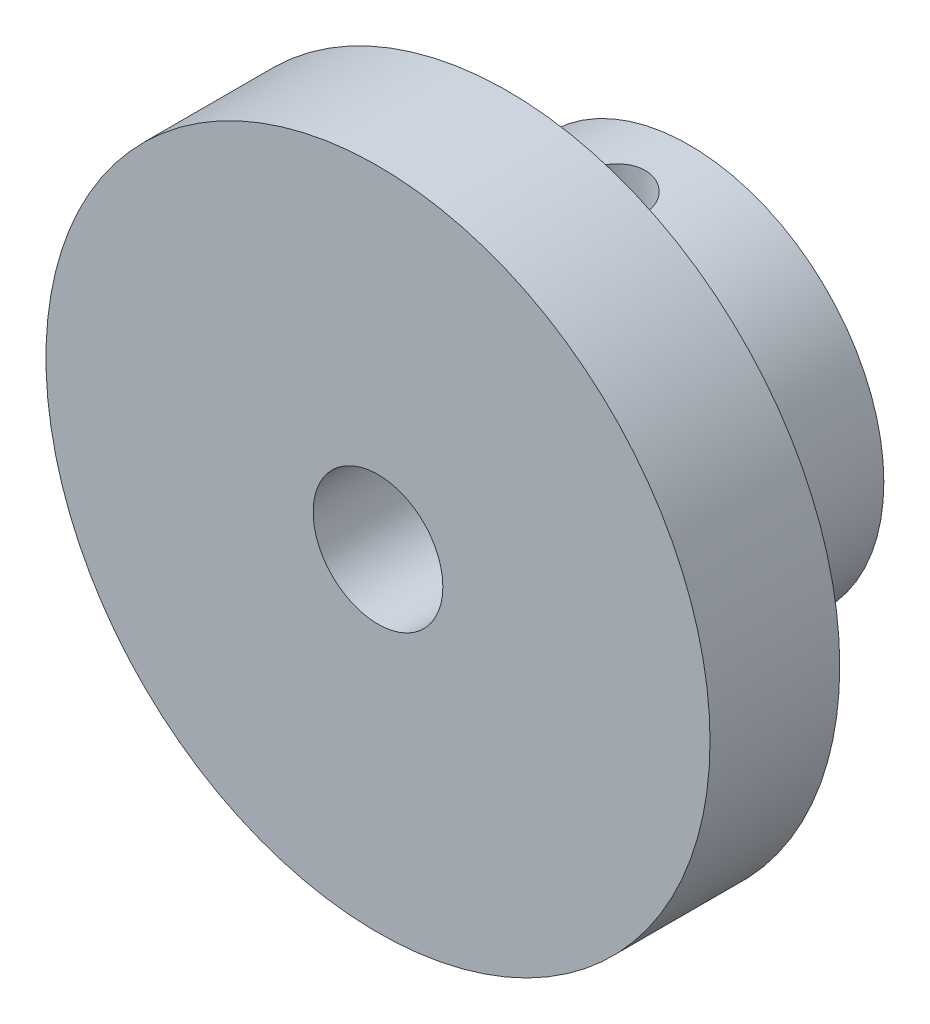
ISO-10303-21;
HEADER;
FILE_DESCRIPTION(('STEP AP214'),'2;1');
FILE_NAME('part.step','',(''),(''),'','','');
FILE_SCHEMA(('AUTOMOTIVE_DESIGN { 1 0 10303 214 1 1 1 1 }'));
ENDSEC;
DATA;
#1=APPLICATION_CONTEXT('core data for automotive mechanical design processes');
#2=APPLICATION_PROTOCOL_DEFINITION('international standard','automotive_design',2000,#1);
#3=PRODUCT_CONTEXT('',#1,'mechanical');
#4=PRODUCT('Part','Part','',(#3));
#5=PRODUCT_RELATED_PRODUCT_CATEGORY('part','',(#4));
#6=PRODUCT_DEFINITION_FORMATION('','',#4);
#7=PRODUCT_DEFINITION_CONTEXT('part definition',#1,'design');
#8=PRODUCT_DEFINITION('design','',#6,#7);
#9=PRODUCT_DEFINITION_SHAPE('','',#8);
#10=(LENGTH_UNIT() NAMED_UNIT(*) SI_UNIT(.MILLI.,.METRE.));
#11=(NAMED_UNIT(*) PLANE_ANGLE_UNIT() SI_UNIT($,.RADIAN.));
#12=(NAMED_UNIT(*) SI_UNIT($,.STERADIAN.) SOLID_ANGLE_UNIT());
#13=UNCERTAINTY_MEASURE_WITH_UNIT(LENGTH_MEASURE(1.E-05),#10,'distance_accuracy_value','');
#14=(GEOMETRIC_REPRESENTATION_CONTEXT(3) GLOBAL_UNCERTAINTY_ASSIGNED_CONTEXT((#13)) GLOBAL_UNIT_ASSIGNED_CONTEXT((#10,
#11,#12)) REPRESENTATION_CONTEXT('',''));
#15=CARTESIAN_POINT('',(0.,0.,0.));
#16=DIRECTION('',(0.,0.,1.));
#17=DIRECTION('',(1.,0.,0.));
#18=AXIS2_PLACEMENT_3D('',#15,#16,#17);
#19=CARTESIAN_POINT('',(0.,0.,7.));
#20=DIRECTION('',(0.,0.,-1.));
#21=DIRECTION('',(-1.,0.,0.));
#22=AXIS2_PLACEMENT_3D('',#19,#20,#21);
#23=CYLINDRICAL_SURFACE('',#22,7.5);
#24=CARTESIAN_POINT('',(0.,7.5,4.29999999999999));
#25=CARTESIAN_POINT('',(-0.0724398447909774,7.4999987322731,4.29999713480323));
#26=CARTESIAN_POINT('',(-0.144918145498401,7.49893959111151,4.29392469969313));
#27=CARTESIAN_POINT('',(-0.287838997586658,7.49481648528476,4.26980720285203));
#28=CARTESIAN_POINT('',(-0.358279665172153,7.49175072368937,4.25175140981125));
#29=CARTESIAN_POINT('',(-0.495037056079598,7.48395795984001,4.20423119988986));
#30=CARTESIAN_POINT('',(-0.561357206809018,7.47923236059877,4.17477641611242));
#31=CARTESIAN_POINT('',(-0.688106386865883,7.46863841510139,4.10532023268403));
#32=CARTESIAN_POINT('',(-0.748536027970825,7.46277018770667,4.06531992987327));
#33=CARTESIAN_POINT('',(-0.862419313309422,7.45047302958428,3.97546994807261));
#34=CARTESIAN_POINT('',(-0.915803450002363,7.44403942512245,3.92553279983517));
#35=CARTESIAN_POINT('',(-1.01347965377153,7.43137205523472,3.8174149060784));
#36=CARTESIAN_POINT('',(-1.05777112348898,7.42513830296116,3.75923361937002));
#37=CARTESIAN_POINT('',(-1.13628655313533,7.41353114747344,3.63579725464702));
#38=CARTESIAN_POINT('',(-1.17044116764745,7.40816378000777,3.57049745016679));
#39=CARTESIAN_POINT('',(-1.22726976900563,7.39896228385757,3.43497868799076));
#40=CARTESIAN_POINT('',(-1.24994459662755,7.39512804289169,3.36476009097467));
#41=CARTESIAN_POINT('',(-1.28294969888162,7.38947362434129,3.22213600107243));
#42=CARTESIAN_POINT('',(-1.29340036048532,7.38763381843554,3.14975916042963));
#43=CARTESIAN_POINT('',(-1.30203386434754,7.38611726921512,3.00425767205234));
#44=CARTESIAN_POINT('',(-1.30021764567898,7.38644036032304,2.93113308198861));
#45=CARTESIAN_POINT('',(-1.28446686747754,7.38919519389469,2.78707512790705));
#46=CARTESIAN_POINT('',(-1.2706680508966,7.3916033155293,2.71612640449628));
#47=CARTESIAN_POINT('',(-1.23155703181357,7.39821986273015,2.57756655497503));
#48=CARTESIAN_POINT('',(-1.2062444051644,7.4024283546183,2.50995555192163));
#49=CARTESIAN_POINT('',(-1.14468818219537,7.41219671468858,2.37958683427038));
#50=CARTESIAN_POINT('',(-1.10838869894239,7.41776346317574,2.31685604457137));
#51=CARTESIAN_POINT('',(-1.02592880229731,7.42961640016175,2.19832450375509));
#52=CARTESIAN_POINT('',(-0.979767529700652,7.43590265132483,2.14252435713771));
#53=CARTESIAN_POINT('',(-0.878157183611076,7.44858981776637,2.03865275882683));
#54=CARTESIAN_POINT('',(-0.822591753127172,7.4549911395167,1.99069510793105));
#55=CARTESIAN_POINT('',(-0.704142624944712,7.46710932055715,1.90476642988428));
#56=CARTESIAN_POINT('',(-0.641258872678941,7.47282617474308,1.86679547720346));
#57=CARTESIAN_POINT('',(-0.509847542269493,7.48294040591933,1.80190573776082));
#58=CARTESIAN_POINT('',(-0.441314626026438,7.48733651624691,1.77499755172079));
#59=CARTESIAN_POINT('',(-0.300608863131159,7.4943038992072,1.73310567344243));
#60=CARTESIAN_POINT('',(-0.228436346788355,7.49687533711874,1.71812090116639));
#61=CARTESIAN_POINT('',(-0.0834803980918283,7.49988127256183,1.70065675206772));
#62=CARTESIAN_POINT('',(-0.0107163105792976,7.50034244826514,1.69802124415496));
#63=CARTESIAN_POINT('',(0.134213405536295,7.49914915870502,1.70491339902996));
#64=CARTESIAN_POINT('',(0.206379058988124,7.49749478173288,1.71444055421652));
#65=CARTESIAN_POINT('',(0.347577136871399,7.49227281825126,1.74525774116925));
#66=CARTESIAN_POINT('',(0.416627055425053,7.4887178940511,1.76646994989062));
#67=CARTESIAN_POINT('',(0.550190600660285,7.48009179881856,1.81997175995333));
#68=CARTESIAN_POINT('',(0.614703955345475,7.47502053696749,1.85226202481471));
#69=CARTESIAN_POINT('',(0.738037625215488,7.46385795675312,1.92735722338537));
#70=CARTESIAN_POINT('',(0.796798103735993,7.4577574148199,1.97025903272262));
#71=CARTESIAN_POINT('',(0.906341500894794,7.44523944788984,2.06522690846743));
#72=CARTESIAN_POINT('',(0.957123789046549,7.43882199790155,2.11729369846039));
#73=CARTESIAN_POINT('',(1.04985252732065,7.42630654067611,2.22981588920069));
#74=CARTESIAN_POINT('',(1.0916931514639,7.42021293917705,2.29035906898263));
#75=CARTESIAN_POINT('',(1.16461025617444,7.40911930936297,2.4177063611878));
#76=CARTESIAN_POINT('',(1.19568709751513,7.40411924439757,2.48451026367288));
#77=CARTESIAN_POINT('',(1.24603871655472,7.39581234401479,2.62219518378742));
#78=CARTESIAN_POINT('',(1.26536488229816,7.39249814651775,2.69305694425807));
#79=CARTESIAN_POINT('',(1.2918273435619,7.3879202485671,2.83708358716461));
#80=CARTESIAN_POINT('',(1.29896479440462,7.38665635377357,2.9102482506474));
#81=CARTESIAN_POINT('',(1.30081300007086,7.38633100286296,3.05574612213087));
#82=CARTESIAN_POINT('',(1.2956904288562,7.38724000617502,3.12807720045278));
#83=CARTESIAN_POINT('',(1.2735257904453,7.39109305373654,3.27083133352559));
#84=CARTESIAN_POINT('',(1.2564837712523,7.3940370897903,3.34125439595946));
#85=CARTESIAN_POINT('',(1.21102987982703,7.40161688002661,3.47812121356259));
#86=CARTESIAN_POINT('',(1.18263350198151,7.40625032804721,3.54457025029067));
#87=CARTESIAN_POINT('',(1.11529439301075,7.41668890125424,3.67178799854623));
#88=CARTESIAN_POINT('',(1.07635106935154,7.42249409226526,3.73255639067346));
#89=CARTESIAN_POINT('',(0.988433390708102,7.43471511111115,3.84752777897956));
#90=CARTESIAN_POINT('',(0.939336807660157,7.44113781478104,3.90163659176602));
#91=CARTESIAN_POINT('',(0.83276326969698,7.45381640848233,4.00090416099672));
#92=CARTESIAN_POINT('',(0.775284387370081,7.46007225975557,4.04606085335596));
#93=CARTESIAN_POINT('',(0.653061699085757,7.4717671318827,4.12645560828061));
#94=CARTESIAN_POINT('',(0.588266425916334,7.47719964423843,4.16161638762512));
#95=CARTESIAN_POINT('',(0.453619362629125,7.48657240831697,4.22049906289207));
#96=CARTESIAN_POINT('',(0.383772598483327,7.49051411962616,4.24423215348016));
#97=CARTESIAN_POINT('',(0.261394898595105,7.49561824401892,4.2745359398695));
#98=CARTESIAN_POINT('',(0.209597073046707,7.49725246863215,4.28406935882906));
#99=CARTESIAN_POINT('',(0.105206249994944,7.49944379647523,4.29680236750822));
#100=CARTESIAN_POINT('',(0.0526132680507083,7.5000009207537,4.30000208100066));
#101=CARTESIAN_POINT('',(0.,7.5,4.29999999999999));
#102=B_SPLINE_CURVE_WITH_KNOTS('',3,(#24,#25,#26,#27,#28,#29,#30,#31,#32,#33,#34,#35,#36,#37,
#38,#39,#40,#41,#42,#43,#44,#45,#46,#47,#48,#49,#50,#51,#52,#53,#54,#55,#56,#57,#58,#59,#60,#61,
#62,#63,#64,#65,#66,#67,#68,#69,#70,#71,#72,#73,#74,#75,#76,#77,#78,#79,#80,#81,#82,#83,#84,#85,
#86,#87,#88,#89,#90,#91,#92,#93,#94,#95,#96,#97,#98,#99,#100,#101),.UNSPECIFIED.,.T.,.F.,(4,2,2,
2,2,2,2,2,2,2,2,2,2,2,2,2,2,2,2,2,2,2,2,2,2,2,2,2,2,2,2,2,2,2,2,2,2,2,4),(0.,0.217127189508833,
0.434449083106592,0.651587721116052,0.868703783424172,1.08782304649496,1.30695670038824,
1.52755659405949,1.74814032872786,1.96653289894895,2.18490875063849,2.40084256964326,
2.61678434388796,2.83384355716752,3.05092168936449,3.27091377018255,3.49090749142105,
3.71111152958697,3.93129561912501,4.14868828352059,4.36607187546455,4.58202488542516,
4.79799083214733,5.01600628447353,5.23403895708842,5.45452440261241,5.67500245733491,
5.8945092494248,6.11399523413675,6.33051431214473,6.54703251816937,6.76325626198093,
6.97949215589786,7.19850092823633,7.41756013871473,7.63826959904825,7.85876240832692,
8.01646559370506,8.17416569722803),.UNSPECIFIED.);
#103=CARTESIAN_POINT('',(0.,7.5,4.29999999999999));
#104=VERTEX_POINT('',#103);
#105=EDGE_CURVE('E69',#104,#104,#102,.T.);
#106=ORIENTED_EDGE('',*,*,#105,.T.);
#107=EDGE_LOOP('',(#106));
#108=FACE_BOUND('',#107,.T.);
#109=CARTESIAN_POINT('',(0.,0.,7.));
#110=DIRECTION('',(0.,0.,1.));
#111=DIRECTION('',(1.,0.,0.));
#112=AXIS2_PLACEMENT_3D('',#109,#110,#111);
#113=CIRCLE('',#112,7.5);
#114=CARTESIAN_POINT('',(7.5,0.,7.));
#115=VERTEX_POINT('',#114);
#116=EDGE_CURVE('E10',#115,#115,#113,.T.);
#117=ORIENTED_EDGE('',*,*,#116,.F.);
#118=EDGE_LOOP('',(#117));
#119=FACE_BOUND('',#118,.T.);
#120=CARTESIAN_POINT('',(0.,0.,0.));
#121=DIRECTION('',(0.,0.,1.));
#122=DIRECTION('',(1.,0.,0.));
#123=AXIS2_PLACEMENT_3D('',#120,#121,#122);
#124=CIRCLE('',#123,7.5);
#125=CARTESIAN_POINT('',(7.5,0.,0.));
#126=VERTEX_POINT('',#125);
#127=EDGE_CURVE('E46',#126,#126,#124,.T.);
#128=ORIENTED_EDGE('',*,*,#127,.T.);
#129=EDGE_LOOP('',(#128));
#130=FACE_BOUND('',#129,.T.);
#131=ADVANCED_FACE('F42',(#108,#119,#130),#23,.T.);
#132=CARTESIAN_POINT('',(0.,0.,0.));
#133=DIRECTION('',(0.,0.,1.));
#134=DIRECTION('',(1.,0.,0.));
#135=AXIS2_PLACEMENT_3D('',#132,#133,#134);
#136=PLANE('',#135);
#137=CARTESIAN_POINT('',(0.,0.,0.));
#138=DIRECTION('',(0.,0.,1.));
#139=DIRECTION('',(1.,0.,0.));
#140=AXIS2_PLACEMENT_3D('',#137,#138,#139);
#141=CIRCLE('',#140,2.5);
#142=CARTESIAN_POINT('',(2.5,0.,0.));
#143=VERTEX_POINT('',#142);
#144=EDGE_CURVE('E61',#143,#143,#141,.T.);
#145=ORIENTED_EDGE('',*,*,#144,.T.);
#146=EDGE_LOOP('',(#145));
#147=FACE_BOUND('',#146,.T.);
#148=ORIENTED_EDGE('',*,*,#127,.F.);
#149=EDGE_LOOP('',(#148));
#150=FACE_BOUND('',#149,.T.);
#151=ADVANCED_FACE('F105',(#147,#150),#136,.F.);
#152=CARTESIAN_POINT('',(0.,0.,12.));
#153=DIRECTION('',(0.,0.,-1.));
#154=DIRECTION('',(-1.,0.,0.));
#155=AXIS2_PLACEMENT_3D('',#152,#153,#154);
#156=CYLINDRICAL_SURFACE('',#155,12.8);
#157=CARTESIAN_POINT('',(0.,0.,12.));
#158=DIRECTION('',(0.,0.,1.));
#159=DIRECTION('',(1.,0.,0.));
#160=AXIS2_PLACEMENT_3D('',#157,#158,#159);
#161=CIRCLE('',#160,12.8);
#162=CARTESIAN_POINT('',(12.8,0.,12.));
#163=VERTEX_POINT('',#162);
#164=EDGE_CURVE('E55',#163,#163,#161,.T.);
#165=ORIENTED_EDGE('',*,*,#164,.F.);
#166=EDGE_LOOP('',(#165));
#167=FACE_BOUND('',#166,.T.);
#168=CARTESIAN_POINT('',(0.,0.,7.));
#169=DIRECTION('',(0.,0.,1.));
#170=DIRECTION('',(1.,0.,0.));
#171=AXIS2_PLACEMENT_3D('',#168,#169,#170);
#172=CIRCLE('',#171,12.8);
#173=CARTESIAN_POINT('',(12.8,0.,7.));
#174=VERTEX_POINT('',#173);
#175=EDGE_CURVE('E57',#174,#174,#172,.T.);
#176=ORIENTED_EDGE('',*,*,#175,.T.);
#177=EDGE_LOOP('',(#176));
#178=FACE_BOUND('',#177,.T.);
#179=ADVANCED_FACE('F100',(#167,#178),#156,.T.);
#180=CARTESIAN_POINT('',(0.,0.,12.));
#181=DIRECTION('',(0.,0.,1.));
#182=DIRECTION('',(1.,0.,0.));
#183=AXIS2_PLACEMENT_3D('',#180,#181,#182);
#184=PLANE('',#183);
#185=CARTESIAN_POINT('',(0.,0.,12.));
#186=DIRECTION('',(0.,0.,1.));
#187=DIRECTION('',(1.,0.,0.));
#188=AXIS2_PLACEMENT_3D('',#185,#186,#187);
#189=CIRCLE('',#188,2.5);
#190=CARTESIAN_POINT('',(2.5,0.,12.));
#191=VERTEX_POINT('',#190);
#192=EDGE_CURVE('E65',#191,#191,#189,.T.);
#193=ORIENTED_EDGE('',*,*,#192,.F.);
#194=EDGE_LOOP('',(#193));
#195=FACE_BOUND('',#194,.T.);
#196=ORIENTED_EDGE('',*,*,#164,.T.);
#197=EDGE_LOOP('',(#196));
#198=FACE_BOUND('',#197,.T.);
#199=ADVANCED_FACE('F97',(#195,#198),#184,.T.);
#200=CARTESIAN_POINT('',(0.,0.,7.));
#201=DIRECTION('',(0.,0.,1.));
#202=DIRECTION('',(1.,0.,0.));
#203=AXIS2_PLACEMENT_3D('',#200,#201,#202);
#204=PLANE('',#203);
#205=ORIENTED_EDGE('',*,*,#116,.T.);
#206=EDGE_LOOP('',(#205));
#207=FACE_BOUND('',#206,.T.);
#208=ORIENTED_EDGE('',*,*,#175,.F.);
#209=EDGE_LOOP('',(#208));
#210=FACE_BOUND('',#209,.T.);
#211=ADVANCED_FACE('F95',(#207,#210),#204,.F.);
#212=CARTESIAN_POINT('',(0.,0.,0.));
#213=DIRECTION('',(0.,0.,1.));
#214=DIRECTION('',(1.,0.,0.));
#215=AXIS2_PLACEMENT_3D('',#212,#213,#214);
#216=CYLINDRICAL_SURFACE('',#215,2.5);
#217=CARTESIAN_POINT('',(0.,2.5,4.29999999999999));
#218=CARTESIAN_POINT('',(0.0680113695059657,2.49999609902581,4.29999558097968));
#219=CARTESIAN_POINT('',(0.136093788180359,2.49719546987896,4.29463162297654));
#220=CARTESIAN_POINT('',(0.270225454250751,2.48626765671663,4.273423033882));
#221=CARTESIAN_POINT('',(0.336271062711262,2.47813145902996,4.25756066682731));
#222=CARTESIAN_POINT('',(0.464188472425049,2.45737911115534,4.21615407054803));
#223=CARTESIAN_POINT('',(0.52607576647719,2.44478082944565,4.19064843084437));
#224=CARTESIAN_POINT('',(0.644589209675043,2.41624205813435,4.13089060896187));
#225=CARTESIAN_POINT('',(0.701215505423525,2.40030166170432,4.0966386706068));
#226=CARTESIAN_POINT('',(0.811667592126633,2.36532501176449,4.01788312810977));
#227=CARTESIAN_POINT('',(0.865083381438267,2.34615603866432,3.97286439852767));
#228=CARTESIAN_POINT('',(0.963989056970099,2.30728290736441,3.87497055716436));
#229=CARTESIAN_POINT('',(1.00947237054757,2.28757832084618,3.82208899701741));
#230=CARTESIAN_POINT('',(1.09513753441025,2.24790755636024,3.70455845520348));
#231=CARTESIAN_POINT('',(1.13453247326665,2.22806332919204,3.63928969900799));
#232=CARTESIAN_POINT('',(1.20162263947399,2.19261300871779,3.5019286437702));
#233=CARTESIAN_POINT('',(1.22932667033737,2.17700372957641,3.4298415293584));
#234=CARTESIAN_POINT('',(1.27036888654655,2.15329918557366,3.28538261934588));
#235=CARTESIAN_POINT('',(1.28448748494984,2.1447999806986,3.21330240270993));
#236=CARTESIAN_POINT('',(1.30032214599433,2.13524197560196,3.06733829912883));
#237=CARTESIAN_POINT('',(1.30205239339102,2.13417466584282,2.99345657226103));
#238=CARTESIAN_POINT('',(1.29363159633311,2.13928164525275,2.85649275191733));
#239=CARTESIAN_POINT('',(1.28501836836426,2.14451886326309,2.79327214308004));
#240=CARTESIAN_POINT('',(1.25884150775024,2.15998772155474,2.66934816643952));
#241=CARTESIAN_POINT('',(1.24127460315842,2.17022118755992,2.60864572762776));
#242=CARTESIAN_POINT('',(1.19739608727306,2.19473990584834,2.48975152758059));
#243=CARTESIAN_POINT('',(1.17089309730273,2.20911272964635,2.43164931861785));
#244=CARTESIAN_POINT('',(1.11004732855924,2.24030417293869,2.32042809671486));
#245=CARTESIAN_POINT('',(1.07570103709793,2.2571238870646,2.26731133163273));
#246=CARTESIAN_POINT('',(0.994600690710103,2.29412683800401,2.15981655563225));
#247=CARTESIAN_POINT('',(0.94678659795537,2.31445310227271,2.10628463283547));
#248=CARTESIAN_POINT('',(0.842817041578248,2.35430677787375,2.00762978696943));
#249=CARTESIAN_POINT('',(0.78665698079226,2.3738337413228,1.96251152943353));
#250=CARTESIAN_POINT('',(0.663774127410599,2.41116994987061,1.87965060642807));
#251=CARTESIAN_POINT('',(0.596644646812704,2.4288294437478,1.84243795998662));
#252=CARTESIAN_POINT('',(0.455930966123093,2.45912356419007,1.78015071661923));
#253=CARTESIAN_POINT('',(0.382352338507073,2.47176247761752,1.75506576037823));
#254=CARTESIAN_POINT('',(0.237696689390575,2.48964687281174,1.7199421707391));
#255=CARTESIAN_POINT('',(0.166960386836865,2.49544064536842,1.70878288196255));
#256=CARTESIAN_POINT('',(0.0243942042796429,2.50089635599645,1.6982683279208));
#257=CARTESIAN_POINT('',(-0.047435071349784,2.50056156803526,1.69890676014066));
#258=CARTESIAN_POINT('',(-0.183618209438065,2.49410050655221,1.71137313423459));
#259=CARTESIAN_POINT('',(-0.248087136366191,2.48847062394008,1.72224207915056));
#260=CARTESIAN_POINT('',(-0.374141031441012,2.47266151578169,1.75331102944846));
#261=CARTESIAN_POINT('',(-0.435725691885606,2.46248180606224,1.77351202791539));
#262=CARTESIAN_POINT('',(-0.556181105208958,2.43814302074764,1.82313115942012));
#263=CARTESIAN_POINT('',(-0.614936096743492,2.4238852987495,1.85278017014389));
#264=CARTESIAN_POINT('',(-0.726817602279266,2.39272108080907,1.92018210792856));
#265=CARTESIAN_POINT('',(-0.77994181239578,2.37581350761577,1.95793833315712));
#266=CARTESIAN_POINT('',(-0.884925243858755,2.33887075877338,2.04499803288043));
#267=CARTESIAN_POINT('',(-0.936078033693244,2.31869319367569,2.09509413429453));
#268=CARTESIAN_POINT('',(-1.02959738484076,2.27871043976582,2.20310677159969));
#269=CARTESIAN_POINT('',(-1.07195663837658,2.25890557300989,2.26102974646842));
#270=CARTESIAN_POINT('',(-1.14910272035529,2.22070397734204,2.38733673410916));
#271=CARTESIAN_POINT('',(-1.18328973831135,2.20246093456135,2.45613791542059));
#272=CARTESIAN_POINT('',(-1.23924098239167,2.17147835100918,2.59975141512398));
#273=CARTESIAN_POINT('',(-1.26102233570193,2.1587312285444,2.67455528255513));
#274=CARTESIAN_POINT('',(-1.28943999012577,2.14186687422015,2.82027124591388));
#275=CARTESIAN_POINT('',(-1.29734839119878,2.13702798664101,2.89084921061158));
#276=CARTESIAN_POINT('',(-1.3015203399281,2.13449180299613,3.0324609798733));
#277=CARTESIAN_POINT('',(-1.2977904998874,2.13679045171326,3.10349450272353));
#278=CARTESIAN_POINT('',(-1.28000345427719,2.14748109373078,3.23567610593051));
#279=CARTESIAN_POINT('',(-1.26713384169056,2.15517118633996,3.29704873313192));
#280=CARTESIAN_POINT('',(-1.23298733247354,2.17488587021126,3.41666977993838));
#281=CARTESIAN_POINT('',(-1.21170751826452,2.18691196554666,3.4749171073746));
#282=CARTESIAN_POINT('',(-1.15979270017152,2.21490467413759,3.59091755995026));
#283=CARTESIAN_POINT('',(-1.12863261878602,2.23107909446047,3.64838392984563));
#284=CARTESIAN_POINT('',(-1.05838667201273,2.2652468080127,3.75765541039081));
#285=CARTESIAN_POINT('',(-1.01929655715553,2.28324107383965,3.80945746269853));
#286=CARTESIAN_POINT('',(-0.928121386241805,2.3219301192689,3.91322632204944));
#287=CARTESIAN_POINT('',(-0.874994006967028,2.34266114669507,3.96426887192055));
#288=CARTESIAN_POINT('',(-0.760430106723431,2.38231377154674,4.05696539628012));
#289=CARTESIAN_POINT('',(-0.698988646857164,2.40123428195996,4.09861375071996));
#290=CARTESIAN_POINT('',(-0.56798635034821,2.43558032718761,4.17179940036644));
#291=CARTESIAN_POINT('',(-0.498306712219087,2.45094198545967,4.20315557424179));
#292=CARTESIAN_POINT('',(-0.353697863564504,2.47593211426922,4.25328257101943));
#293=CARTESIAN_POINT('',(-0.278783693118581,2.48557631190442,4.27208793572085));
#294=CARTESIAN_POINT('',(-0.169188039913594,2.49449662438316,4.28939079306565));
#295=CARTESIAN_POINT('',(-0.135513064047047,2.49655400233432,4.29336255907374));
#296=CARTESIAN_POINT('',(-0.0678979669149598,2.49930667952064,4.29866829577143));
#297=CARTESIAN_POINT('',(-0.0339578396300258,2.50000194774281,4.30000220640143));
#298=CARTESIAN_POINT('',(0.,2.5,4.29999999999999));
#299=B_SPLINE_CURVE_WITH_KNOTS('',3,(#217,#218,#219,#220,#221,#222,#223,#224,#225,#226,#227,
#228,#229,#230,#231,#232,#233,#234,#235,#236,#237,#238,#239,#240,#241,#242,#243,#244,#245,#246,
#247,#248,#249,#250,#251,#252,#253,#254,#255,#256,#257,#258,#259,#260,#261,#262,#263,#264,#265,
#266,#267,#268,#269,#270,#271,#272,#273,#274,#275,#276,#277,#278,#279,#280,#281,#282,#283,#284,
#285,#286,#287,#288,#289,#290,#291,#292,#293,#294,#295,#296,#297,#298),.UNSPECIFIED.,.T.,.F.,(4,
2,2,2,2,2,2,2,2,2,2,2,2,2,2,2,2,2,2,2,2,2,2,2,2,2,2,2,2,2,2,2,2,2,2,2,2,2,2,2,4),(0.,
0.203896806366285,0.408138957322478,0.611572296877391,0.814999965865628,1.03142326439271,
1.24802504237353,1.48316517792176,1.71812793040786,1.93860407014475,2.15882772260557,
2.34998891208855,2.54122000784162,2.73683841649128,2.9325446069,3.15538331852189,
3.37834523326736,3.61335022619279,3.84815412468367,4.06249724663535,4.27672586667118,
4.47268293759257,4.66866086639621,4.8698516955817,5.07112452858473,5.2933343320654,
5.51572806791227,5.75134168970872,5.98662923131482,6.19892188281191,6.41109394154318,
6.59980430594199,6.78858019329842,6.98982480284756,7.19117753962886,7.41974793265729,
7.64845470667185,7.88099383218264,8.11289030496959,8.2146929515237,8.31649791592827),.UNSPECIFIED.);
#300=CARTESIAN_POINT('',(0.,2.5,4.29999999999999));
#301=VERTEX_POINT('',#300);
#302=EDGE_CURVE('E80',#301,#301,#299,.T.);
#303=ORIENTED_EDGE('',*,*,#302,.T.);
#304=EDGE_LOOP('',(#303));
#305=FACE_BOUND('',#304,.T.);
#306=ORIENTED_EDGE('',*,*,#144,.F.);
#307=EDGE_LOOP('',(#306));
#308=FACE_BOUND('',#307,.T.);
#309=ORIENTED_EDGE('',*,*,#192,.T.);
#310=EDGE_LOOP('',(#309));
#311=FACE_BOUND('',#310,.T.);
#312=ADVANCED_FACE('F88',(#305,#308,#311),#216,.F.);
#313=CARTESIAN_POINT('',(0.,7.5,3.));
#314=DIRECTION('',(0.,1.,0.));
#315=DIRECTION('',(0.,0.,1.));
#316=AXIS2_PLACEMENT_3D('',#313,#314,#315);
#317=CYLINDRICAL_SURFACE('',#316,1.29999999999999);
#318=ORIENTED_EDGE('',*,*,#302,.F.);
#319=EDGE_LOOP('',(#318));
#320=FACE_BOUND('',#319,.T.);
#321=ORIENTED_EDGE('',*,*,#105,.F.);
#322=EDGE_LOOP('',(#321));
#323=FACE_BOUND('',#322,.T.);
#324=ADVANCED_FACE('F85',(#320,#323),#317,.F.);
#325=CLOSED_SHELL('',(#131,#151,#179,#199,#211,#312,#324));
#326=MANIFOLD_SOLID_BREP('B2',#325);
#327=ADVANCED_BREP_SHAPE_REPRESENTATION('',(#18,#326),#14);
#328=SHAPE_DEFINITION_REPRESENTATION(#9,#327);
ENDSEC;
END-ISO-10303-21;
